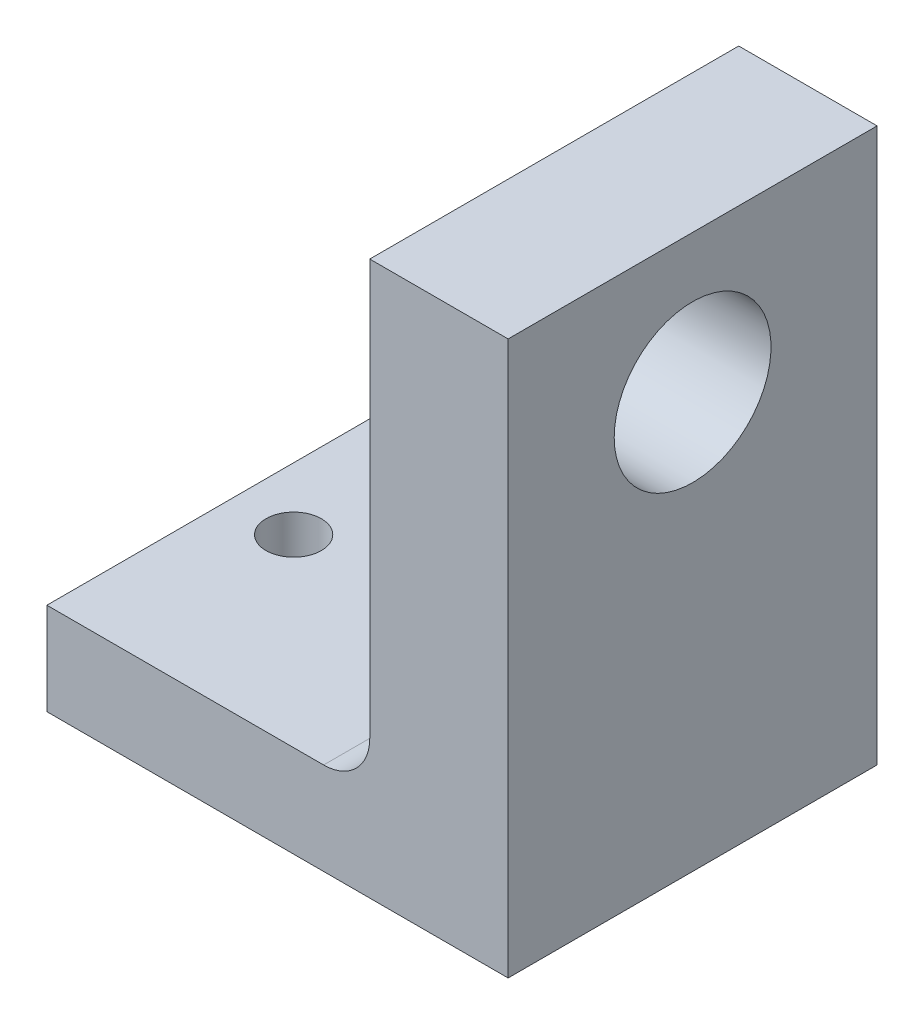
ISO-10303-21;
HEADER;
FILE_DESCRIPTION(('STEP AP214'),'2;1');
FILE_NAME('part.step','',(''),(''),'','','');
FILE_SCHEMA(('AUTOMOTIVE_DESIGN { 1 0 10303 214 1 1 1 1 }'));
ENDSEC;
DATA;
#1=APPLICATION_CONTEXT('core data for automotive mechanical design processes');
#2=APPLICATION_PROTOCOL_DEFINITION('international standard','automotive_design',2000,#1);
#3=PRODUCT_CONTEXT('',#1,'mechanical');
#4=PRODUCT('Part','Part','',(#3));
#5=PRODUCT_RELATED_PRODUCT_CATEGORY('part','',(#4));
#6=PRODUCT_DEFINITION_FORMATION('','',#4);
#7=PRODUCT_DEFINITION_CONTEXT('part definition',#1,'design');
#8=PRODUCT_DEFINITION('design','',#6,#7);
#9=PRODUCT_DEFINITION_SHAPE('','',#8);
#10=(LENGTH_UNIT() NAMED_UNIT(*) SI_UNIT(.MILLI.,.METRE.));
#11=(NAMED_UNIT(*) PLANE_ANGLE_UNIT() SI_UNIT($,.RADIAN.));
#12=(NAMED_UNIT(*) SI_UNIT($,.STERADIAN.) SOLID_ANGLE_UNIT());
#13=UNCERTAINTY_MEASURE_WITH_UNIT(LENGTH_MEASURE(1.E-05),#10,'distance_accuracy_value','');
#14=(GEOMETRIC_REPRESENTATION_CONTEXT(3) GLOBAL_UNCERTAINTY_ASSIGNED_CONTEXT((#13)) GLOBAL_UNIT_ASSIGNED_CONTEXT((#10,
#11,#12)) REPRESENTATION_CONTEXT('',''));
#15=CARTESIAN_POINT('',(0.,0.,0.));
#16=DIRECTION('',(0.,0.,1.));
#17=DIRECTION('',(1.,0.,0.));
#18=AXIS2_PLACEMENT_3D('',#15,#16,#17);
#19=CARTESIAN_POINT('',(-5.,-4.,8.));
#20=DIRECTION('',(1.,0.,0.));
#21=DIRECTION('',(0.,1.,0.));
#22=AXIS2_PLACEMENT_3D('',#19,#20,#21);
#23=PLANE('',#22);
#24=DIRECTION('',(0.,-1.,0.));
#25=VECTOR('',#24,1.);
#26=CARTESIAN_POINT('',(-5.,-4.,0.));
#27=LINE('',#26,#25);
#28=CARTESIAN_POINT('',(-5.,-4.,0.));
#29=VERTEX_POINT('',#28);
#30=CARTESIAN_POINT('',(-5.,-6.,0.));
#31=VERTEX_POINT('',#30);
#32=EDGE_CURVE('E121',#29,#31,#27,.T.);
#33=ORIENTED_EDGE('',*,*,#32,.T.);
#34=DIRECTION('',(0.,0.,-1.));
#35=VECTOR('',#34,1.);
#36=CARTESIAN_POINT('',(-5.,-6.,8.));
#37=LINE('',#36,#35);
#38=CARTESIAN_POINT('',(-5.,-6.,8.));
#39=VERTEX_POINT('',#38);
#40=EDGE_CURVE('E102',#39,#31,#37,.T.);
#41=ORIENTED_EDGE('',*,*,#40,.F.);
#42=DIRECTION('',(0.,-1.,0.));
#43=VECTOR('',#42,1.);
#44=CARTESIAN_POINT('',(-5.,-4.,8.));
#45=LINE('',#44,#43);
#46=CARTESIAN_POINT('',(-5.,-4.,8.));
#47=VERTEX_POINT('',#46);
#48=EDGE_CURVE('E109',#47,#39,#45,.T.);
#49=ORIENTED_EDGE('',*,*,#48,.F.);
#50=DIRECTION('',(0.,0.,-1.));
#51=VECTOR('',#50,1.);
#52=CARTESIAN_POINT('',(-5.,-4.,8.));
#53=LINE('',#52,#51);
#54=EDGE_CURVE('E135',#47,#29,#53,.T.);
#55=ORIENTED_EDGE('',*,*,#54,.T.);
#56=EDGE_LOOP('',(#33,#41,#49,#55));
#57=FACE_BOUND('',#56,.T.);
#58=ADVANCED_FACE('F39',(#57),#23,.F.);
#59=CARTESIAN_POINT('',(-5.,-6.,8.));
#60=DIRECTION('',(0.,1.,0.));
#61=DIRECTION('',(-1.,0.,0.));
#62=AXIS2_PLACEMENT_3D('',#59,#60,#61);
#63=PLANE('',#62);
#64=CARTESIAN_POINT('',(-1.11,-6.,4.));
#65=DIRECTION('',(0.,1.,0.));
#66=DIRECTION('',(-1.,0.,0.));
#67=AXIS2_PLACEMENT_3D('',#64,#65,#66);
#68=CIRCLE('',#67,0.6);
#69=CARTESIAN_POINT('',(-1.71,-6.,4.));
#70=VERTEX_POINT('',#69);
#71=EDGE_CURVE('E147',#70,#70,#68,.T.);
#72=ORIENTED_EDGE('',*,*,#71,.T.);
#73=EDGE_LOOP('',(#72));
#74=FACE_BOUND('',#73,.T.);
#75=CARTESIAN_POINT('',(-3.65,-6.00000000000001,4.));
#76=DIRECTION('',(0.,1.,0.));
#77=DIRECTION('',(-1.,0.,0.));
#78=AXIS2_PLACEMENT_3D('',#75,#76,#77);
#79=CIRCLE('',#78,0.600000000000003);
#80=CARTESIAN_POINT('',(-4.25,-6.00000000000001,4.));
#81=VERTEX_POINT('',#80);
#82=EDGE_CURVE('E154',#81,#81,#79,.T.);
#83=ORIENTED_EDGE('',*,*,#82,.T.);
#84=EDGE_LOOP('',(#83));
#85=FACE_BOUND('',#84,.T.);
#86=DIRECTION('',(1.,0.,0.));
#87=VECTOR('',#86,1.);
#88=CARTESIAN_POINT('',(-5.,-6.,0.));
#89=LINE('',#88,#87);
#90=CARTESIAN_POINT('',(5.,-6.,0.));
#91=VERTEX_POINT('',#90);
#92=EDGE_CURVE('E144',#31,#91,#89,.T.);
#93=ORIENTED_EDGE('',*,*,#92,.T.);
#94=DIRECTION('',(0.,0.,-1.));
#95=VECTOR('',#94,1.);
#96=CARTESIAN_POINT('',(5.,-6.,8.));
#97=LINE('',#96,#95);
#98=CARTESIAN_POINT('',(5.,-6.,8.));
#99=VERTEX_POINT('',#98);
#100=EDGE_CURVE('E105',#99,#91,#97,.T.);
#101=ORIENTED_EDGE('',*,*,#100,.F.);
#102=DIRECTION('',(1.,0.,0.));
#103=VECTOR('',#102,1.);
#104=CARTESIAN_POINT('',(-5.,-6.,8.));
#105=LINE('',#104,#103);
#106=EDGE_CURVE('E98',#39,#99,#105,.T.);
#107=ORIENTED_EDGE('',*,*,#106,.F.);
#108=ORIENTED_EDGE('',*,*,#40,.T.);
#109=EDGE_LOOP('',(#93,#101,#107,#108));
#110=FACE_BOUND('',#109,.T.);
#111=ADVANCED_FACE('F100',(#74,#85,#110),#63,.F.);
#112=CARTESIAN_POINT('',(5.,-6.,8.));
#113=DIRECTION('',(-1.,0.,0.));
#114=DIRECTION('',(0.,-1.,0.));
#115=AXIS2_PLACEMENT_3D('',#112,#113,#114);
#116=PLANE('',#115);
#117=CARTESIAN_POINT('',(5.,3.,4.));
#118=DIRECTION('',(-1.,0.,0.));
#119=DIRECTION('',(0.,0.,1.));
#120=AXIS2_PLACEMENT_3D('',#117,#118,#119);
#121=CIRCLE('',#120,1.7);
#122=CARTESIAN_POINT('',(5.,3.,5.7));
#123=VERTEX_POINT('',#122);
#124=EDGE_CURVE('E158',#123,#123,#121,.T.);
#125=ORIENTED_EDGE('',*,*,#124,.T.);
#126=EDGE_LOOP('',(#125));
#127=FACE_BOUND('',#126,.T.);
#128=DIRECTION('',(0.,1.,0.));
#129=VECTOR('',#128,1.);
#130=CARTESIAN_POINT('',(5.,-6.,0.));
#131=LINE('',#130,#129);
#132=CARTESIAN_POINT('',(5.,6.,0.));
#133=VERTEX_POINT('',#132);
#134=EDGE_CURVE('E142',#91,#133,#131,.T.);
#135=ORIENTED_EDGE('',*,*,#134,.T.);
#136=DIRECTION('',(0.,0.,-1.));
#137=VECTOR('',#136,1.);
#138=CARTESIAN_POINT('',(5.,6.,8.));
#139=LINE('',#138,#137);
#140=CARTESIAN_POINT('',(5.,6.,8.));
#141=VERTEX_POINT('',#140);
#142=EDGE_CURVE('E126',#141,#133,#139,.T.);
#143=ORIENTED_EDGE('',*,*,#142,.F.);
#144=DIRECTION('',(0.,1.,0.));
#145=VECTOR('',#144,1.);
#146=CARTESIAN_POINT('',(5.,-6.,8.));
#147=LINE('',#146,#145);
#148=EDGE_CURVE('E108',#99,#141,#147,.T.);
#149=ORIENTED_EDGE('',*,*,#148,.F.);
#150=ORIENTED_EDGE('',*,*,#100,.T.);
#151=EDGE_LOOP('',(#135,#143,#149,#150));
#152=FACE_BOUND('',#151,.T.);
#153=ADVANCED_FACE('F188',(#127,#152),#116,.F.);
#154=CARTESIAN_POINT('',(5.,6.,8.));
#155=DIRECTION('',(0.,-1.,0.));
#156=DIRECTION('',(1.,0.,0.));
#157=AXIS2_PLACEMENT_3D('',#154,#155,#156);
#158=PLANE('',#157);
#159=DIRECTION('',(-1.,0.,0.));
#160=VECTOR('',#159,1.);
#161=CARTESIAN_POINT('',(5.,6.,0.));
#162=LINE('',#161,#160);
#163=CARTESIAN_POINT('',(2.,6.,0.));
#164=VERTEX_POINT('',#163);
#165=EDGE_CURVE('E140',#133,#164,#162,.T.);
#166=ORIENTED_EDGE('',*,*,#165,.T.);
#167=DIRECTION('',(0.,0.,-1.));
#168=VECTOR('',#167,1.);
#169=CARTESIAN_POINT('',(2.,6.,8.));
#170=LINE('',#169,#168);
#171=CARTESIAN_POINT('',(2.,6.,8.));
#172=VERTEX_POINT('',#171);
#173=EDGE_CURVE('E132',#172,#164,#170,.T.);
#174=ORIENTED_EDGE('',*,*,#173,.F.);
#175=DIRECTION('',(-1.,0.,0.));
#176=VECTOR('',#175,1.);
#177=CARTESIAN_POINT('',(5.,6.,8.));
#178=LINE('',#177,#176);
#179=EDGE_CURVE('E151',#141,#172,#178,.T.);
#180=ORIENTED_EDGE('',*,*,#179,.F.);
#181=ORIENTED_EDGE('',*,*,#142,.T.);
#182=EDGE_LOOP('',(#166,#174,#180,#181));
#183=FACE_BOUND('',#182,.T.);
#184=ADVANCED_FACE('F177',(#183),#158,.F.);
#185=CARTESIAN_POINT('',(2.,6.,8.));
#186=DIRECTION('',(1.,0.,0.));
#187=DIRECTION('',(0.,1.,0.));
#188=AXIS2_PLACEMENT_3D('',#185,#186,#187);
#189=PLANE('',#188);
#190=CARTESIAN_POINT('',(2.,3.,4.));
#191=DIRECTION('',(-1.,0.,0.));
#192=DIRECTION('',(0.,0.,1.));
#193=AXIS2_PLACEMENT_3D('',#190,#191,#192);
#194=CIRCLE('',#193,1.7);
#195=CARTESIAN_POINT('',(2.,3.,5.7));
#196=VERTEX_POINT('',#195);
#197=EDGE_CURVE('E168',#196,#196,#194,.T.);
#198=ORIENTED_EDGE('',*,*,#197,.F.);
#199=EDGE_LOOP('',(#198));
#200=FACE_BOUND('',#199,.T.);
#201=DIRECTION('',(0.,-1.,0.));
#202=VECTOR('',#201,1.);
#203=CARTESIAN_POINT('',(2.,6.,0.));
#204=LINE('',#203,#202);
#205=CARTESIAN_POINT('',(2.,-3.,0.));
#206=VERTEX_POINT('',#205);
#207=EDGE_CURVE('E138',#164,#206,#204,.T.);
#208=ORIENTED_EDGE('',*,*,#207,.T.);
#209=DIRECTION('',(0.,0.,-1.));
#210=VECTOR('',#209,1.);
#211=CARTESIAN_POINT('',(2.,-3.,8.));
#212=LINE('',#211,#210);
#213=CARTESIAN_POINT('',(2.,-3.,8.));
#214=VERTEX_POINT('',#213);
#215=EDGE_CURVE('E54',#206,#214,#212,.F.);
#216=ORIENTED_EDGE('',*,*,#215,.T.);
#217=DIRECTION('',(0.,-1.,0.));
#218=VECTOR('',#217,1.);
#219=CARTESIAN_POINT('',(2.,6.,8.));
#220=LINE('',#219,#218);
#221=EDGE_CURVE('E149',#172,#214,#220,.T.);
#222=ORIENTED_EDGE('',*,*,#221,.F.);
#223=ORIENTED_EDGE('',*,*,#173,.T.);
#224=EDGE_LOOP('',(#208,#216,#222,#223));
#225=FACE_BOUND('',#224,.T.);
#226=ADVANCED_FACE('F174',(#200,#225),#189,.F.);
#227=CARTESIAN_POINT('',(2.,-4.,8.));
#228=DIRECTION('',(0.,-1.,0.));
#229=DIRECTION('',(1.,0.,0.));
#230=AXIS2_PLACEMENT_3D('',#227,#228,#229);
#231=PLANE('',#230);
#232=CARTESIAN_POINT('',(-1.11,-4.,4.));
#233=DIRECTION('',(0.,1.,0.));
#234=DIRECTION('',(-1.,0.,0.));
#235=AXIS2_PLACEMENT_3D('',#232,#233,#234);
#236=CIRCLE('',#235,0.6);
#237=CARTESIAN_POINT('',(-1.71,-4.,4.));
#238=VERTEX_POINT('',#237);
#239=EDGE_CURVE('E161',#238,#238,#236,.T.);
#240=ORIENTED_EDGE('',*,*,#239,.F.);
#241=EDGE_LOOP('',(#240));
#242=FACE_BOUND('',#241,.T.);
#243=CARTESIAN_POINT('',(-3.65,-4.,4.));
#244=DIRECTION('',(0.,1.,0.));
#245=DIRECTION('',(-1.,0.,0.));
#246=AXIS2_PLACEMENT_3D('',#243,#244,#245);
#247=CIRCLE('',#246,0.600000000000003);
#248=CARTESIAN_POINT('',(-4.25,-4.,4.));
#249=VERTEX_POINT('',#248);
#250=EDGE_CURVE('E157',#249,#249,#247,.T.);
#251=ORIENTED_EDGE('',*,*,#250,.F.);
#252=EDGE_LOOP('',(#251));
#253=FACE_BOUND('',#252,.T.);
#254=DIRECTION('',(-1.,0.,0.));
#255=VECTOR('',#254,1.);
#256=CARTESIAN_POINT('',(2.,-4.,8.));
#257=LINE('',#256,#255);
#258=CARTESIAN_POINT('',(1.,-4.,8.));
#259=VERTEX_POINT('',#258);
#260=EDGE_CURVE('E114',#259,#47,#257,.T.);
#261=ORIENTED_EDGE('',*,*,#260,.F.);
#262=DIRECTION('',(0.,0.,-1.));
#263=VECTOR('',#262,1.);
#264=CARTESIAN_POINT('',(1.,-4.,0.));
#265=LINE('',#264,#263);
#266=CARTESIAN_POINT('',(1.,-4.,0.));
#267=VERTEX_POINT('',#266);
#268=EDGE_CURVE('E122',#259,#267,#265,.T.);
#269=ORIENTED_EDGE('',*,*,#268,.T.);
#270=DIRECTION('',(-1.,0.,0.));
#271=VECTOR('',#270,1.);
#272=CARTESIAN_POINT('',(2.,-4.,0.));
#273=LINE('',#272,#271);
#274=EDGE_CURVE('E118',#267,#29,#273,.T.);
#275=ORIENTED_EDGE('',*,*,#274,.T.);
#276=ORIENTED_EDGE('',*,*,#54,.F.);
#277=EDGE_LOOP('',(#261,#269,#275,#276));
#278=FACE_BOUND('',#277,.T.);
#279=ADVANCED_FACE('F176',(#242,#253,#278),#231,.F.);
#280=CARTESIAN_POINT('',(0.,0.,8.));
#281=DIRECTION('',(0.,0.,1.));
#282=DIRECTION('',(1.,0.,0.));
#283=AXIS2_PLACEMENT_3D('',#280,#281,#282);
#284=PLANE('',#283);
#285=ORIENTED_EDGE('',*,*,#48,.T.);
#286=ORIENTED_EDGE('',*,*,#106,.T.);
#287=ORIENTED_EDGE('',*,*,#148,.T.);
#288=ORIENTED_EDGE('',*,*,#179,.T.);
#289=ORIENTED_EDGE('',*,*,#221,.T.);
#290=CARTESIAN_POINT('',(1.,-3.,8.));
#291=DIRECTION('',(0.,0.,1.));
#292=DIRECTION('',(1.,0.,0.));
#293=AXIS2_PLACEMENT_3D('',#290,#291,#292);
#294=CIRCLE('',#293,1.);
#295=EDGE_CURVE('E11',#214,#259,#294,.F.);
#296=ORIENTED_EDGE('',*,*,#295,.T.);
#297=ORIENTED_EDGE('',*,*,#260,.T.);
#298=EDGE_LOOP('',(#285,#286,#287,#288,#289,#296,#297));
#299=FACE_BOUND('',#298,.T.);
#300=ADVANCED_FACE('F112',(#299),#284,.T.);
#301=CARTESIAN_POINT('',(0.,0.,0.));
#302=DIRECTION('',(0.,0.,1.));
#303=DIRECTION('',(1.,0.,0.));
#304=AXIS2_PLACEMENT_3D('',#301,#302,#303);
#305=PLANE('',#304);
#306=ORIENTED_EDGE('',*,*,#32,.F.);
#307=ORIENTED_EDGE('',*,*,#274,.F.);
#308=CARTESIAN_POINT('',(1.,-3.,0.));
#309=DIRECTION('',(0.,0.,1.));
#310=DIRECTION('',(1.,0.,0.));
#311=AXIS2_PLACEMENT_3D('',#308,#309,#310);
#312=CIRCLE('',#311,1.);
#313=EDGE_CURVE('E47',#267,#206,#312,.T.);
#314=ORIENTED_EDGE('',*,*,#313,.T.);
#315=ORIENTED_EDGE('',*,*,#207,.F.);
#316=ORIENTED_EDGE('',*,*,#165,.F.);
#317=ORIENTED_EDGE('',*,*,#134,.F.);
#318=ORIENTED_EDGE('',*,*,#92,.F.);
#319=EDGE_LOOP('',(#306,#307,#314,#315,#316,#317,#318));
#320=FACE_BOUND('',#319,.T.);
#321=ADVANCED_FACE('F185',(#320),#305,.F.);
#322=CARTESIAN_POINT('',(-3.65,-6.00000000000001,4.));
#323=DIRECTION('',(0.,1.,0.));
#324=DIRECTION('',(-1.,0.,0.));
#325=AXIS2_PLACEMENT_3D('',#322,#323,#324);
#326=CYLINDRICAL_SURFACE('',#325,0.600000000000003);
#327=ORIENTED_EDGE('',*,*,#82,.F.);
#328=EDGE_LOOP('',(#327));
#329=FACE_BOUND('',#328,.T.);
#330=ORIENTED_EDGE('',*,*,#250,.T.);
#331=EDGE_LOOP('',(#330));
#332=FACE_BOUND('',#331,.T.);
#333=ADVANCED_FACE('F212',(#329,#332),#326,.F.);
#334=CARTESIAN_POINT('',(-1.11,-6.,4.));
#335=DIRECTION('',(0.,1.,0.));
#336=DIRECTION('',(-1.,0.,0.));
#337=AXIS2_PLACEMENT_3D('',#334,#335,#336);
#338=CYLINDRICAL_SURFACE('',#337,0.6);
#339=ORIENTED_EDGE('',*,*,#71,.F.);
#340=EDGE_LOOP('',(#339));
#341=FACE_BOUND('',#340,.T.);
#342=ORIENTED_EDGE('',*,*,#239,.T.);
#343=EDGE_LOOP('',(#342));
#344=FACE_BOUND('',#343,.T.);
#345=ADVANCED_FACE('F214',(#341,#344),#338,.F.);
#346=CARTESIAN_POINT('',(2.,3.,4.));
#347=DIRECTION('',(-1.,0.,0.));
#348=DIRECTION('',(0.,0.,1.));
#349=AXIS2_PLACEMENT_3D('',#346,#347,#348);
#350=CYLINDRICAL_SURFACE('',#349,1.7);
#351=ORIENTED_EDGE('',*,*,#124,.F.);
#352=EDGE_LOOP('',(#351));
#353=FACE_BOUND('',#352,.T.);
#354=ORIENTED_EDGE('',*,*,#197,.T.);
#355=EDGE_LOOP('',(#354));
#356=FACE_BOUND('',#355,.T.);
#357=ADVANCED_FACE('F172',(#353,#356),#350,.F.);
#358=CARTESIAN_POINT('',(1.,-3.,8.));
#359=DIRECTION('',(0.,0.,1.));
#360=DIRECTION('',(1.,0.,0.));
#361=AXIS2_PLACEMENT_3D('',#358,#359,#360);
#362=CYLINDRICAL_SURFACE('',#361,1.);
#363=ORIENTED_EDGE('',*,*,#295,.F.);
#364=ORIENTED_EDGE('',*,*,#215,.F.);
#365=ORIENTED_EDGE('',*,*,#313,.F.);
#366=ORIENTED_EDGE('',*,*,#268,.F.);
#367=EDGE_LOOP('',(#363,#364,#365,#366));
#368=FACE_BOUND('',#367,.T.);
#369=ADVANCED_FACE('F41',(#368),#362,.F.);
#370=CLOSED_SHELL('',(#58,#111,#153,#184,#226,#279,#300,#321,#333,#345,#357,#369));
#371=MANIFOLD_SOLID_BREP('B2',#370);
#372=ADVANCED_BREP_SHAPE_REPRESENTATION('',(#18,#371),#14);
#373=SHAPE_DEFINITION_REPRESENTATION(#9,#372);
ENDSEC;
END-ISO-10303-21;
